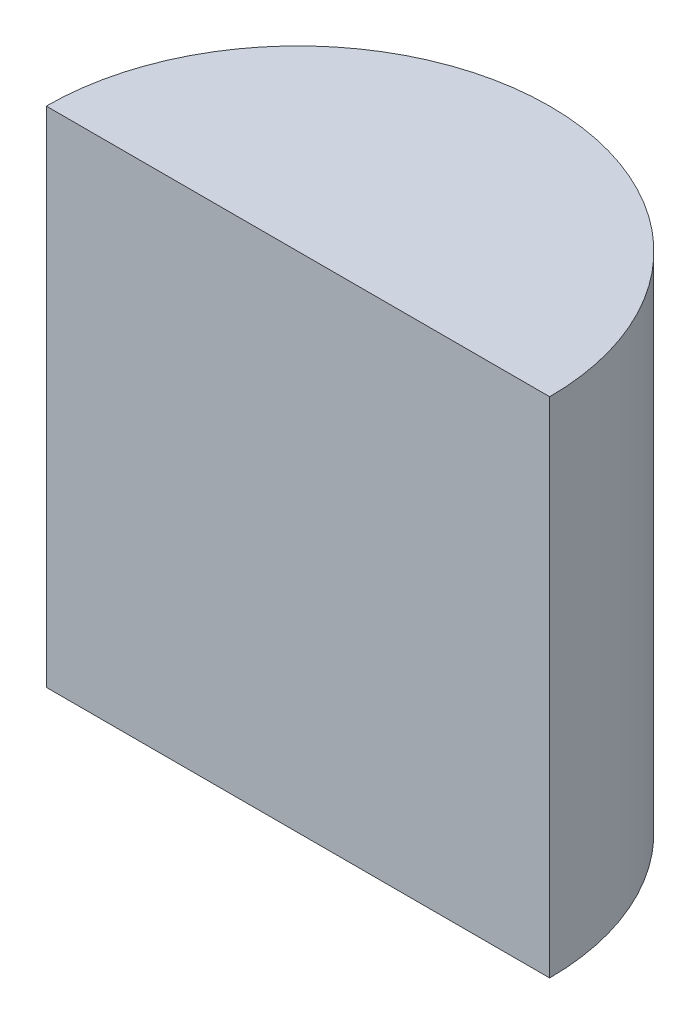
ISO-10303-21;
HEADER;
FILE_DESCRIPTION(('STEP AP214'),'2;1');
FILE_NAME('part.step','',(''),(''),'','','');
FILE_SCHEMA(('AUTOMOTIVE_DESIGN { 1 0 10303 214 1 1 1 1 }'));
ENDSEC;
DATA;
#1=APPLICATION_CONTEXT('core data for automotive mechanical design processes');
#2=APPLICATION_PROTOCOL_DEFINITION('international standard','automotive_design',2000,#1);
#3=PRODUCT_CONTEXT('',#1,'mechanical');
#4=PRODUCT('Part','Part','',(#3));
#5=PRODUCT_RELATED_PRODUCT_CATEGORY('part','',(#4));
#6=PRODUCT_DEFINITION_FORMATION('','',#4);
#7=PRODUCT_DEFINITION_CONTEXT('part definition',#1,'design');
#8=PRODUCT_DEFINITION('design','',#6,#7);
#9=PRODUCT_DEFINITION_SHAPE('','',#8);
#10=(LENGTH_UNIT() NAMED_UNIT(*) SI_UNIT(.MILLI.,.METRE.));
#11=(NAMED_UNIT(*) PLANE_ANGLE_UNIT() SI_UNIT($,.RADIAN.));
#12=(NAMED_UNIT(*) SI_UNIT($,.STERADIAN.) SOLID_ANGLE_UNIT());
#13=UNCERTAINTY_MEASURE_WITH_UNIT(LENGTH_MEASURE(1.E-05),#10,'distance_accuracy_value','');
#14=(GEOMETRIC_REPRESENTATION_CONTEXT(3) GLOBAL_UNCERTAINTY_ASSIGNED_CONTEXT((#13)) GLOBAL_UNIT_ASSIGNED_CONTEXT((#10,
#11,#12)) REPRESENTATION_CONTEXT('',''));
#15=CARTESIAN_POINT('',(0.,0.,0.));
#16=DIRECTION('',(0.,0.,1.));
#17=DIRECTION('',(1.,0.,0.));
#18=AXIS2_PLACEMENT_3D('',#15,#16,#17);
#19=CARTESIAN_POINT('',(0.,10.,0.));
#20=DIRECTION('',(0.,-1.,0.));
#21=DIRECTION('',(0.,0.,-1.));
#22=AXIS2_PLACEMENT_3D('',#19,#20,#21);
#23=CYLINDRICAL_SURFACE('',#22,5.);
#24=CARTESIAN_POINT('',(0.,0.,0.));
#25=DIRECTION('',(0.,1.,0.));
#26=DIRECTION('',(0.,0.,1.));
#27=AXIS2_PLACEMENT_3D('',#24,#25,#26);
#28=CIRCLE('',#27,5.);
#29=CARTESIAN_POINT('',(5.,0.,0.));
#30=VERTEX_POINT('',#29);
#31=CARTESIAN_POINT('',(-5.,0.,0.));
#32=VERTEX_POINT('',#31);
#33=EDGE_CURVE('E66',#30,#32,#28,.T.);
#34=ORIENTED_EDGE('',*,*,#33,.T.);
#35=DIRECTION('',(0.,-1.,0.));
#36=VECTOR('',#35,1.);
#37=CARTESIAN_POINT('',(-5.,10.,0.));
#38=LINE('',#37,#36);
#39=CARTESIAN_POINT('',(-5.,10.,0.));
#40=VERTEX_POINT('',#39);
#41=EDGE_CURVE('E11',#40,#32,#38,.T.);
#42=ORIENTED_EDGE('',*,*,#41,.F.);
#43=CARTESIAN_POINT('',(0.,10.,0.));
#44=DIRECTION('',(0.,1.,0.));
#45=DIRECTION('',(0.,0.,1.));
#46=AXIS2_PLACEMENT_3D('',#43,#44,#45);
#47=CIRCLE('',#46,5.);
#48=CARTESIAN_POINT('',(5.,10.,0.));
#49=VERTEX_POINT('',#48);
#50=EDGE_CURVE('E65',#49,#40,#47,.T.);
#51=ORIENTED_EDGE('',*,*,#50,.F.);
#52=DIRECTION('',(0.,-1.,0.));
#53=VECTOR('',#52,1.);
#54=CARTESIAN_POINT('',(5.,10.,0.));
#55=LINE('',#54,#53);
#56=EDGE_CURVE('E43',#49,#30,#55,.T.);
#57=ORIENTED_EDGE('',*,*,#56,.T.);
#58=EDGE_LOOP('',(#34,#42,#51,#57));
#59=FACE_BOUND('',#58,.T.);
#60=ADVANCED_FACE('F35',(#59),#23,.T.);
#61=CARTESIAN_POINT('',(-5.,10.,0.));
#62=DIRECTION('',(0.,0.,-1.));
#63=DIRECTION('',(-1.,0.,0.));
#64=AXIS2_PLACEMENT_3D('',#61,#62,#63);
#65=PLANE('',#64);
#66=DIRECTION('',(1.,0.,0.));
#67=VECTOR('',#66,1.);
#68=CARTESIAN_POINT('',(-5.,0.,0.));
#69=LINE('',#68,#67);
#70=EDGE_CURVE('E58',#32,#30,#69,.T.);
#71=ORIENTED_EDGE('',*,*,#70,.T.);
#72=ORIENTED_EDGE('',*,*,#56,.F.);
#73=DIRECTION('',(1.,0.,0.));
#74=VECTOR('',#73,1.);
#75=CARTESIAN_POINT('',(-5.,10.,0.));
#76=LINE('',#75,#74);
#77=EDGE_CURVE('E50',#40,#49,#76,.T.);
#78=ORIENTED_EDGE('',*,*,#77,.F.);
#79=ORIENTED_EDGE('',*,*,#41,.T.);
#80=EDGE_LOOP('',(#71,#72,#78,#79));
#81=FACE_BOUND('',#80,.T.);
#82=ADVANCED_FACE('F61',(#81),#65,.F.);
#83=CARTESIAN_POINT('',(0.,10.,0.));
#84=DIRECTION('',(0.,1.,0.));
#85=DIRECTION('',(0.,0.,1.));
#86=AXIS2_PLACEMENT_3D('',#83,#84,#85);
#87=PLANE('',#86);
#88=ORIENTED_EDGE('',*,*,#50,.T.);
#89=ORIENTED_EDGE('',*,*,#77,.T.);
#90=EDGE_LOOP('',(#88,#89));
#91=FACE_BOUND('',#90,.T.);
#92=ADVANCED_FACE('F73',(#91),#87,.T.);
#93=CARTESIAN_POINT('',(0.,0.,0.));
#94=DIRECTION('',(0.,1.,0.));
#95=DIRECTION('',(0.,0.,1.));
#96=AXIS2_PLACEMENT_3D('',#93,#94,#95);
#97=PLANE('',#96);
#98=ORIENTED_EDGE('',*,*,#33,.F.);
#99=ORIENTED_EDGE('',*,*,#70,.F.);
#100=EDGE_LOOP('',(#98,#99));
#101=FACE_BOUND('',#100,.T.);
#102=ADVANCED_FACE('F69',(#101),#97,.F.);
#103=CLOSED_SHELL('',(#60,#82,#92,#102));
#104=MANIFOLD_SOLID_BREP('B2',#103);
#105=ADVANCED_BREP_SHAPE_REPRESENTATION('',(#18,#104),#14);
#106=SHAPE_DEFINITION_REPRESENTATION(#9,#105);
ENDSEC;
END-ISO-10303-21;
